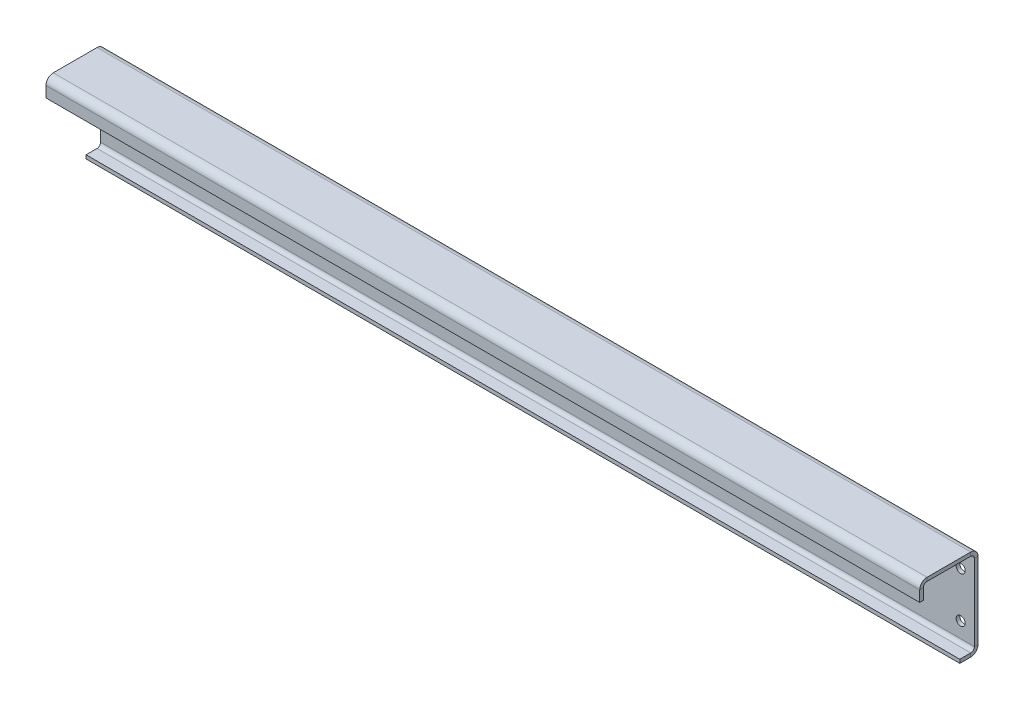
ISO-10303-21;
HEADER;
FILE_DESCRIPTION(('STEP AP214'),'2;1');
FILE_NAME('part.step','',(''),(''),'','','');
FILE_SCHEMA(('AUTOMOTIVE_DESIGN { 1 0 10303 214 1 1 1 1 }'));
ENDSEC;
DATA;
#1=APPLICATION_CONTEXT('core data for automotive mechanical design processes');
#2=APPLICATION_PROTOCOL_DEFINITION('international standard','automotive_design',2000,#1);
#3=PRODUCT_CONTEXT('',#1,'mechanical');
#4=PRODUCT('Part','Part','',(#3));
#5=PRODUCT_RELATED_PRODUCT_CATEGORY('part','',(#4));
#6=PRODUCT_DEFINITION_FORMATION('','',#4);
#7=PRODUCT_DEFINITION_CONTEXT('part definition',#1,'design');
#8=PRODUCT_DEFINITION('design','',#6,#7);
#9=PRODUCT_DEFINITION_SHAPE('','',#8);
#10=(LENGTH_UNIT() NAMED_UNIT(*) SI_UNIT(.MILLI.,.METRE.));
#11=(NAMED_UNIT(*) PLANE_ANGLE_UNIT() SI_UNIT($,.RADIAN.));
#12=(NAMED_UNIT(*) SI_UNIT($,.STERADIAN.) SOLID_ANGLE_UNIT());
#13=UNCERTAINTY_MEASURE_WITH_UNIT(LENGTH_MEASURE(1.E-05),#10,'distance_accuracy_value','');
#14=(GEOMETRIC_REPRESENTATION_CONTEXT(3) GLOBAL_UNCERTAINTY_ASSIGNED_CONTEXT((#13)) GLOBAL_UNIT_ASSIGNED_CONTEXT((#10,
#11,#12)) REPRESENTATION_CONTEXT('',''));
#15=CARTESIAN_POINT('',(0.,0.,0.));
#16=DIRECTION('',(0.,0.,1.));
#17=DIRECTION('',(1.,0.,0.));
#18=AXIS2_PLACEMENT_3D('',#15,#16,#17);
#19=CARTESIAN_POINT('',(-240.,37.8968253968254,-12.9523809523809));
#20=DIRECTION('',(1.,0.,0.));
#21=DIRECTION('',(0.,-1.,0.));
#22=AXIS2_PLACEMENT_3D('',#19,#20,#21);
#23=PLANE('',#22);
#24=DIRECTION('',(0.,0.,-1.));
#25=VECTOR('',#24,1.);
#26=CARTESIAN_POINT('',(-240.,-8.10317460317459,-12.952380952381));
#27=LINE('',#26,#25);
#28=CARTESIAN_POINT('',(-240.,-8.10317460317459,-10.952380952381));
#29=VERTEX_POINT('',#28);
#30=CARTESIAN_POINT('',(-240.,-8.10317460317459,-12.952380952381));
#31=VERTEX_POINT('',#30);
#32=EDGE_CURVE('E11',#29,#31,#27,.T.);
#33=ORIENTED_EDGE('',*,*,#32,.F.);
#34=DIRECTION('',(0.,1.,0.));
#35=VECTOR('',#34,1.);
#36=CARTESIAN_POINT('',(-240.,37.8968253968254,-10.9523809523809));
#37=LINE('',#36,#35);
#38=CARTESIAN_POINT('',(-240.,33.8968253968254,-10.9523809523809));
#39=VERTEX_POINT('',#38);
#40=EDGE_CURVE('E112',#39,#29,#37,.F.);
#41=ORIENTED_EDGE('',*,*,#40,.F.);
#42=DIRECTION('',(0.,0.,-1.));
#43=VECTOR('',#42,1.);
#44=CARTESIAN_POINT('',(-240.,33.8968253968254,-12.9523809523809));
#45=LINE('',#44,#43);
#46=CARTESIAN_POINT('',(-240.,33.8968253968254,-12.9523809523809));
#47=VERTEX_POINT('',#46);
#48=EDGE_CURVE('E48',#39,#47,#45,.T.);
#49=ORIENTED_EDGE('',*,*,#48,.T.);
#50=DIRECTION('',(0.,-1.,0.));
#51=VECTOR('',#50,1.);
#52=CARTESIAN_POINT('',(-240.,37.8968253968254,-12.9523809523809));
#53=LINE('',#52,#51);
#54=EDGE_CURVE('E115',#47,#31,#53,.T.);
#55=ORIENTED_EDGE('',*,*,#54,.T.);
#56=EDGE_LOOP('',(#33,#41,#49,#55));
#57=FACE_BOUND('',#56,.T.);
#58=ADVANCED_FACE('F38',(#57),#23,.F.);
#59=CARTESIAN_POINT('',(-240.,33.8968253968254,-8.95238095238095));
#60=DIRECTION('',(1.,0.,0.));
#61=DIRECTION('',(0.,0.,-1.));
#62=AXIS2_PLACEMENT_3D('',#59,#60,#61);
#63=PLANE('',#62);
#64=ORIENTED_EDGE('',*,*,#48,.F.);
#65=CARTESIAN_POINT('',(-240.,33.8968253968254,-8.95238095238095));
#66=DIRECTION('',(-1.,0.,0.));
#67=DIRECTION('',(0.,0.,1.));
#68=AXIS2_PLACEMENT_3D('',#65,#66,#67);
#69=CIRCLE('',#68,2.);
#70=CARTESIAN_POINT('',(-240.,35.8968253968254,-8.95238095238095));
#71=VERTEX_POINT('',#70);
#72=EDGE_CURVE('E154',#39,#71,#69,.F.);
#73=ORIENTED_EDGE('',*,*,#72,.T.);
#74=DIRECTION('',(0.,1.,0.));
#75=VECTOR('',#74,1.);
#76=CARTESIAN_POINT('',(-240.,37.8968253968254,-8.95238095238095));
#77=LINE('',#76,#75);
#78=CARTESIAN_POINT('',(-240.,37.8968253968254,-8.95238095238095));
#79=VERTEX_POINT('',#78);
#80=EDGE_CURVE('E191',#71,#79,#77,.T.);
#81=ORIENTED_EDGE('',*,*,#80,.T.);
#82=CARTESIAN_POINT('',(-240.,33.8968253968254,-8.95238095238095));
#83=DIRECTION('',(-1.,0.,0.));
#84=DIRECTION('',(0.,0.,1.));
#85=AXIS2_PLACEMENT_3D('',#82,#83,#84);
#86=CIRCLE('',#85,4.);
#87=EDGE_CURVE('E213',#47,#79,#86,.F.);
#88=ORIENTED_EDGE('',*,*,#87,.F.);
#89=EDGE_LOOP('',(#64,#73,#81,#88));
#90=FACE_BOUND('',#89,.T.);
#91=ADVANCED_FACE('F214',(#90),#63,.F.);
#92=CARTESIAN_POINT('',(-240.,37.8968253968254,19.0476190476191));
#93=DIRECTION('',(1.,0.,0.));
#94=DIRECTION('',(0.,0.,-1.));
#95=AXIS2_PLACEMENT_3D('',#92,#93,#94);
#96=PLANE('',#95);
#97=ORIENTED_EDGE('',*,*,#80,.F.);
#98=DIRECTION('',(0.,0.,1.));
#99=VECTOR('',#98,1.);
#100=CARTESIAN_POINT('',(-240.,35.8968253968254,19.0476190476191));
#101=LINE('',#100,#99);
#102=CARTESIAN_POINT('',(-240.,35.8968253968254,15.0476190476191));
#103=VERTEX_POINT('',#102);
#104=EDGE_CURVE('E267',#103,#71,#101,.F.);
#105=ORIENTED_EDGE('',*,*,#104,.F.);
#106=DIRECTION('',(0.,1.,0.));
#107=VECTOR('',#106,1.);
#108=CARTESIAN_POINT('',(-240.,37.8968253968254,15.0476190476191));
#109=LINE('',#108,#107);
#110=CARTESIAN_POINT('',(-240.,37.8968253968254,15.0476190476191));
#111=VERTEX_POINT('',#110);
#112=EDGE_CURVE('E56',#103,#111,#109,.T.);
#113=ORIENTED_EDGE('',*,*,#112,.T.);
#114=DIRECTION('',(0.,0.,-1.));
#115=VECTOR('',#114,1.);
#116=CARTESIAN_POINT('',(-240.,37.8968253968254,19.0476190476191));
#117=LINE('',#116,#115);
#118=EDGE_CURVE('E294',#111,#79,#117,.T.);
#119=ORIENTED_EDGE('',*,*,#118,.T.);
#120=EDGE_LOOP('',(#97,#105,#113,#119));
#121=FACE_BOUND('',#120,.T.);
#122=ADVANCED_FACE('F293',(#121),#96,.F.);
#123=CARTESIAN_POINT('',(-240.,33.8968253968254,15.0476190476191));
#124=DIRECTION('',(1.,0.,0.));
#125=DIRECTION('',(0.,0.,-1.));
#126=AXIS2_PLACEMENT_3D('',#123,#124,#125);
#127=PLANE('',#126);
#128=ORIENTED_EDGE('',*,*,#112,.F.);
#129=CARTESIAN_POINT('',(-240.,33.8968253968254,15.0476190476191));
#130=DIRECTION('',(-1.,0.,0.));
#131=DIRECTION('',(0.,0.,1.));
#132=AXIS2_PLACEMENT_3D('',#129,#130,#131);
#133=CIRCLE('',#132,2.);
#134=CARTESIAN_POINT('',(-240.,33.8968253968254,17.0476190476191));
#135=VERTEX_POINT('',#134);
#136=EDGE_CURVE('E271',#103,#135,#133,.F.);
#137=ORIENTED_EDGE('',*,*,#136,.T.);
#138=DIRECTION('',(0.,0.,1.));
#139=VECTOR('',#138,1.);
#140=CARTESIAN_POINT('',(-240.,33.8968253968254,19.0476190476191));
#141=LINE('',#140,#139);
#142=CARTESIAN_POINT('',(-240.,33.8968253968254,19.0476190476191));
#143=VERTEX_POINT('',#142);
#144=EDGE_CURVE('E187',#135,#143,#141,.T.);
#145=ORIENTED_EDGE('',*,*,#144,.T.);
#146=CARTESIAN_POINT('',(-240.,33.8968253968254,15.0476190476191));
#147=DIRECTION('',(-1.,0.,0.));
#148=DIRECTION('',(0.,0.,1.));
#149=AXIS2_PLACEMENT_3D('',#146,#147,#148);
#150=CIRCLE('',#149,4.);
#151=EDGE_CURVE('E240',#111,#143,#150,.F.);
#152=ORIENTED_EDGE('',*,*,#151,.F.);
#153=EDGE_LOOP('',(#128,#137,#145,#152));
#154=FACE_BOUND('',#153,.T.);
#155=ADVANCED_FACE('F402',(#154),#127,.F.);
#156=CARTESIAN_POINT('',(-240.,27.8968253968254,19.0476190476191));
#157=DIRECTION('',(1.,0.,0.));
#158=DIRECTION('',(0.,1.,0.));
#159=AXIS2_PLACEMENT_3D('',#156,#157,#158);
#160=PLANE('',#159);
#161=ORIENTED_EDGE('',*,*,#144,.F.);
#162=DIRECTION('',(0.,1.,0.));
#163=VECTOR('',#162,1.);
#164=CARTESIAN_POINT('',(-240.,27.8968253968254,17.0476190476191));
#165=LINE('',#164,#163);
#166=CARTESIAN_POINT('',(-240.,27.8968253968254,17.0476190476191));
#167=VERTEX_POINT('',#166);
#168=EDGE_CURVE('E151',#167,#135,#165,.T.);
#169=ORIENTED_EDGE('',*,*,#168,.F.);
#170=DIRECTION('',(0.,0.,1.));
#171=VECTOR('',#170,1.);
#172=CARTESIAN_POINT('',(-240.,27.8968253968254,19.0476190476191));
#173=LINE('',#172,#171);
#174=CARTESIAN_POINT('',(-240.,27.8968253968254,19.0476190476191));
#175=VERTEX_POINT('',#174);
#176=EDGE_CURVE('E184',#167,#175,#173,.T.);
#177=ORIENTED_EDGE('',*,*,#176,.T.);
#178=DIRECTION('',(0.,1.,0.));
#179=VECTOR('',#178,1.);
#180=CARTESIAN_POINT('',(-240.,27.8968253968254,19.0476190476191));
#181=LINE('',#180,#179);
#182=EDGE_CURVE('E334',#175,#143,#181,.T.);
#183=ORIENTED_EDGE('',*,*,#182,.T.);
#184=EDGE_LOOP('',(#161,#169,#177,#183));
#185=FACE_BOUND('',#184,.T.);
#186=ADVANCED_FACE('F335',(#185),#160,.F.);
#187=CARTESIAN_POINT('',(240.,27.8968253968254,19.0476190476191));
#188=DIRECTION('',(0.,1.,0.));
#189=DIRECTION('',(-1.,0.,0.));
#190=AXIS2_PLACEMENT_3D('',#187,#188,#189);
#191=PLANE('',#190);
#192=ORIENTED_EDGE('',*,*,#176,.F.);
#193=DIRECTION('',(1.,0.,0.));
#194=VECTOR('',#193,1.);
#195=CARTESIAN_POINT('',(240.,27.8968253968254,17.0476190476191));
#196=LINE('',#195,#194);
#197=CARTESIAN_POINT('',(240.,27.8968253968254,17.0476190476191));
#198=VERTEX_POINT('',#197);
#199=EDGE_CURVE('E275',#198,#167,#196,.F.);
#200=ORIENTED_EDGE('',*,*,#199,.F.);
#201=DIRECTION('',(0.,0.,1.));
#202=VECTOR('',#201,1.);
#203=CARTESIAN_POINT('',(240.,27.8968253968254,19.0476190476191));
#204=LINE('',#203,#202);
#205=CARTESIAN_POINT('',(240.,27.8968253968254,19.0476190476191));
#206=VERTEX_POINT('',#205);
#207=EDGE_CURVE('E181',#198,#206,#204,.T.);
#208=ORIENTED_EDGE('',*,*,#207,.T.);
#209=DIRECTION('',(-1.,0.,0.));
#210=VECTOR('',#209,1.);
#211=CARTESIAN_POINT('',(240.,27.8968253968254,19.0476190476191));
#212=LINE('',#211,#210);
#213=EDGE_CURVE('E325',#206,#175,#212,.T.);
#214=ORIENTED_EDGE('',*,*,#213,.T.);
#215=EDGE_LOOP('',(#192,#200,#208,#214));
#216=FACE_BOUND('',#215,.T.);
#217=ADVANCED_FACE('F376',(#216),#191,.F.);
#218=CARTESIAN_POINT('',(240.,27.8968253968254,19.0476190476191));
#219=DIRECTION('',(1.,0.,0.));
#220=DIRECTION('',(0.,1.,0.));
#221=AXIS2_PLACEMENT_3D('',#218,#219,#220);
#222=PLANE('',#221);
#223=ORIENTED_EDGE('',*,*,#207,.F.);
#224=DIRECTION('',(0.,1.,0.));
#225=VECTOR('',#224,1.);
#226=CARTESIAN_POINT('',(240.,27.8968253968254,17.0476190476191));
#227=LINE('',#226,#225);
#228=CARTESIAN_POINT('',(240.,33.8968253968254,17.0476190476191));
#229=VERTEX_POINT('',#228);
#230=EDGE_CURVE('E272',#198,#229,#227,.T.);
#231=ORIENTED_EDGE('',*,*,#230,.T.);
#232=DIRECTION('',(0.,0.,1.));
#233=VECTOR('',#232,1.);
#234=CARTESIAN_POINT('',(240.,33.8968253968254,19.0476190476191));
#235=LINE('',#234,#233);
#236=CARTESIAN_POINT('',(240.,33.8968253968254,19.0476190476191));
#237=VERTEX_POINT('',#236);
#238=EDGE_CURVE('E178',#229,#237,#235,.T.);
#239=ORIENTED_EDGE('',*,*,#238,.T.);
#240=DIRECTION('',(0.,1.,0.));
#241=VECTOR('',#240,1.);
#242=CARTESIAN_POINT('',(240.,27.8968253968254,19.0476190476191));
#243=LINE('',#242,#241);
#244=EDGE_CURVE('E300',#206,#237,#243,.T.);
#245=ORIENTED_EDGE('',*,*,#244,.F.);
#246=EDGE_LOOP('',(#223,#231,#239,#245));
#247=FACE_BOUND('',#246,.T.);
#248=ADVANCED_FACE('F313',(#247),#222,.T.);
#249=CARTESIAN_POINT('',(240.,33.8968253968254,15.0476190476191));
#250=DIRECTION('',(-1.,0.,0.));
#251=DIRECTION('',(0.,0.,1.));
#252=AXIS2_PLACEMENT_3D('',#249,#250,#251);
#253=PLANE('',#252);
#254=ORIENTED_EDGE('',*,*,#238,.F.);
#255=CARTESIAN_POINT('',(240.,33.8968253968254,15.0476190476191));
#256=DIRECTION('',(-1.,0.,0.));
#257=DIRECTION('',(0.,0.,1.));
#258=AXIS2_PLACEMENT_3D('',#255,#256,#257);
#259=CIRCLE('',#258,2.);
#260=CARTESIAN_POINT('',(240.,35.8968253968254,15.0476190476191));
#261=VERTEX_POINT('',#260);
#262=EDGE_CURVE('E268',#229,#261,#259,.T.);
#263=ORIENTED_EDGE('',*,*,#262,.T.);
#264=DIRECTION('',(0.,1.,0.));
#265=VECTOR('',#264,1.);
#266=CARTESIAN_POINT('',(240.,37.8968253968254,15.0476190476191));
#267=LINE('',#266,#265);
#268=CARTESIAN_POINT('',(240.,37.8968253968254,15.0476190476191));
#269=VERTEX_POINT('',#268);
#270=EDGE_CURVE('E176',#261,#269,#267,.T.);
#271=ORIENTED_EDGE('',*,*,#270,.T.);
#272=CARTESIAN_POINT('',(240.,33.8968253968254,15.0476190476191));
#273=DIRECTION('',(1.,0.,0.));
#274=DIRECTION('',(0.,0.,-1.));
#275=AXIS2_PLACEMENT_3D('',#272,#273,#274);
#276=CIRCLE('',#275,4.);
#277=EDGE_CURVE('E219',#237,#269,#276,.F.);
#278=ORIENTED_EDGE('',*,*,#277,.F.);
#279=EDGE_LOOP('',(#254,#263,#271,#278));
#280=FACE_BOUND('',#279,.T.);
#281=ADVANCED_FACE('F327',(#280),#253,.F.);
#282=CARTESIAN_POINT('',(240.,37.8968253968254,19.0476190476191));
#283=DIRECTION('',(1.,0.,0.));
#284=DIRECTION('',(0.,0.,-1.));
#285=AXIS2_PLACEMENT_3D('',#282,#283,#284);
#286=PLANE('',#285);
#287=ORIENTED_EDGE('',*,*,#270,.F.);
#288=DIRECTION('',(0.,0.,1.));
#289=VECTOR('',#288,1.);
#290=CARTESIAN_POINT('',(240.,35.8968253968254,19.0476190476191));
#291=LINE('',#290,#289);
#292=CARTESIAN_POINT('',(240.,35.8968253968254,-8.95238095238095));
#293=VERTEX_POINT('',#292);
#294=EDGE_CURVE('E144',#261,#293,#291,.F.);
#295=ORIENTED_EDGE('',*,*,#294,.T.);
#296=DIRECTION('',(0.,1.,0.));
#297=VECTOR('',#296,1.);
#298=CARTESIAN_POINT('',(240.,37.8968253968254,-8.95238095238095));
#299=LINE('',#298,#297);
#300=CARTESIAN_POINT('',(240.,37.8968253968254,-8.95238095238095));
#301=VERTEX_POINT('',#300);
#302=EDGE_CURVE('E173',#293,#301,#299,.T.);
#303=ORIENTED_EDGE('',*,*,#302,.T.);
#304=DIRECTION('',(0.,0.,-1.));
#305=VECTOR('',#304,1.);
#306=CARTESIAN_POINT('',(240.,37.8968253968254,19.0476190476191));
#307=LINE('',#306,#305);
#308=EDGE_CURVE('E210',#269,#301,#307,.T.);
#309=ORIENTED_EDGE('',*,*,#308,.F.);
#310=EDGE_LOOP('',(#287,#295,#303,#309));
#311=FACE_BOUND('',#310,.T.);
#312=ADVANCED_FACE('F382',(#311),#286,.T.);
#313=CARTESIAN_POINT('',(240.,33.8968253968254,-8.95238095238095));
#314=DIRECTION('',(-1.,0.,0.));
#315=DIRECTION('',(0.,0.,1.));
#316=AXIS2_PLACEMENT_3D('',#313,#314,#315);
#317=PLANE('',#316);
#318=ORIENTED_EDGE('',*,*,#302,.F.);
#319=CARTESIAN_POINT('',(240.,33.8968253968254,-8.95238095238095));
#320=DIRECTION('',(-1.,0.,0.));
#321=DIRECTION('',(0.,0.,1.));
#322=AXIS2_PLACEMENT_3D('',#319,#320,#321);
#323=CIRCLE('',#322,2.);
#324=CARTESIAN_POINT('',(240.,33.8968253968254,-10.9523809523809));
#325=VERTEX_POINT('',#324);
#326=EDGE_CURVE('E149',#293,#325,#323,.T.);
#327=ORIENTED_EDGE('',*,*,#326,.T.);
#328=DIRECTION('',(0.,0.,-1.));
#329=VECTOR('',#328,1.);
#330=CARTESIAN_POINT('',(240.,33.8968253968254,-12.9523809523809));
#331=LINE('',#330,#329);
#332=CARTESIAN_POINT('',(240.,33.8968253968254,-12.9523809523809));
#333=VERTEX_POINT('',#332);
#334=EDGE_CURVE('E170',#325,#333,#331,.T.);
#335=ORIENTED_EDGE('',*,*,#334,.T.);
#336=CARTESIAN_POINT('',(240.,33.8968253968254,-8.95238095238095));
#337=DIRECTION('',(1.,0.,0.));
#338=DIRECTION('',(0.,0.,-1.));
#339=AXIS2_PLACEMENT_3D('',#336,#337,#338);
#340=CIRCLE('',#339,4.);
#341=EDGE_CURVE('E218',#301,#333,#340,.F.);
#342=ORIENTED_EDGE('',*,*,#341,.F.);
#343=EDGE_LOOP('',(#318,#327,#335,#342));
#344=FACE_BOUND('',#343,.T.);
#345=ADVANCED_FACE('F384',(#344),#317,.F.);
#346=CARTESIAN_POINT('',(240.,37.8968253968254,-12.9523809523809));
#347=DIRECTION('',(1.,0.,0.));
#348=DIRECTION('',(0.,-1.,0.));
#349=AXIS2_PLACEMENT_3D('',#346,#347,#348);
#350=PLANE('',#349);
#351=ORIENTED_EDGE('',*,*,#334,.F.);
#352=DIRECTION('',(0.,1.,0.));
#353=VECTOR('',#352,1.);
#354=CARTESIAN_POINT('',(240.,37.8968253968254,-10.9523809523809));
#355=LINE('',#354,#353);
#356=CARTESIAN_POINT('',(240.,-8.10317460317459,-10.952380952381));
#357=VERTEX_POINT('',#356);
#358=EDGE_CURVE('E143',#325,#357,#355,.F.);
#359=ORIENTED_EDGE('',*,*,#358,.T.);
#360=DIRECTION('',(0.,0.,-1.));
#361=VECTOR('',#360,1.);
#362=CARTESIAN_POINT('',(240.,-8.10317460317459,-12.952380952381));
#363=LINE('',#362,#361);
#364=CARTESIAN_POINT('',(240.,-8.10317460317459,-12.952380952381));
#365=VERTEX_POINT('',#364);
#366=EDGE_CURVE('E167',#357,#365,#363,.T.);
#367=ORIENTED_EDGE('',*,*,#366,.T.);
#368=DIRECTION('',(0.,-1.,0.));
#369=VECTOR('',#368,1.);
#370=CARTESIAN_POINT('',(240.,37.8968253968254,-12.9523809523809));
#371=LINE('',#370,#369);
#372=EDGE_CURVE('E209',#333,#365,#371,.T.);
#373=ORIENTED_EDGE('',*,*,#372,.F.);
#374=EDGE_LOOP('',(#351,#359,#367,#373));
#375=FACE_BOUND('',#374,.T.);
#376=ADVANCED_FACE('F390',(#375),#350,.T.);
#377=CARTESIAN_POINT('',(240.,-8.10317460317459,-8.95238095238095));
#378=DIRECTION('',(-1.,0.,0.));
#379=DIRECTION('',(0.,0.,1.));
#380=AXIS2_PLACEMENT_3D('',#377,#378,#379);
#381=PLANE('',#380);
#382=ORIENTED_EDGE('',*,*,#366,.F.);
#383=CARTESIAN_POINT('',(240.,-8.10317460317459,-8.95238095238095));
#384=DIRECTION('',(-1.,0.,0.));
#385=DIRECTION('',(0.,0.,1.));
#386=AXIS2_PLACEMENT_3D('',#383,#384,#385);
#387=CIRCLE('',#386,2.);
#388=CARTESIAN_POINT('',(240.,-10.1031746031746,-8.95238095238095));
#389=VERTEX_POINT('',#388);
#390=EDGE_CURVE('E131',#357,#389,#387,.T.);
#391=ORIENTED_EDGE('',*,*,#390,.T.);
#392=DIRECTION('',(0.,-1.,0.));
#393=VECTOR('',#392,1.);
#394=CARTESIAN_POINT('',(240.,-12.1031746031746,-8.95238095238095));
#395=LINE('',#394,#393);
#396=CARTESIAN_POINT('',(240.,-12.1031746031746,-8.95238095238095));
#397=VERTEX_POINT('',#396);
#398=EDGE_CURVE('E164',#389,#397,#395,.T.);
#399=ORIENTED_EDGE('',*,*,#398,.T.);
#400=CARTESIAN_POINT('',(240.,-8.10317460317459,-8.95238095238095));
#401=DIRECTION('',(1.,0.,0.));
#402=DIRECTION('',(0.,0.,-1.));
#403=AXIS2_PLACEMENT_3D('',#400,#401,#402);
#404=CIRCLE('',#403,4.);
#405=EDGE_CURVE('E337',#365,#397,#404,.F.);
#406=ORIENTED_EDGE('',*,*,#405,.F.);
#407=EDGE_LOOP('',(#382,#391,#399,#406));
#408=FACE_BOUND('',#407,.T.);
#409=ADVANCED_FACE('F440',(#408),#381,.F.);
#410=CARTESIAN_POINT('',(240.,-12.1031746031746,-12.952380952381));
#411=DIRECTION('',(1.,0.,0.));
#412=DIRECTION('',(0.,0.,1.));
#413=AXIS2_PLACEMENT_3D('',#410,#411,#412);
#414=PLANE('',#413);
#415=ORIENTED_EDGE('',*,*,#398,.F.);
#416=DIRECTION('',(0.,0.,-1.));
#417=VECTOR('',#416,1.);
#418=CARTESIAN_POINT('',(240.,-10.1031746031746,-12.952380952381));
#419=LINE('',#418,#417);
#420=CARTESIAN_POINT('',(240.,-10.1031746031746,-2.95238095238095));
#421=VERTEX_POINT('',#420);
#422=EDGE_CURVE('E259',#389,#421,#419,.F.);
#423=ORIENTED_EDGE('',*,*,#422,.T.);
#424=DIRECTION('',(0.,-1.,0.));
#425=VECTOR('',#424,1.);
#426=CARTESIAN_POINT('',(240.,-12.1031746031746,-2.95238095238095));
#427=LINE('',#426,#425);
#428=CARTESIAN_POINT('',(240.,-12.1031746031746,-2.95238095238095));
#429=VERTEX_POINT('',#428);
#430=EDGE_CURVE('E161',#421,#429,#427,.T.);
#431=ORIENTED_EDGE('',*,*,#430,.T.);
#432=DIRECTION('',(0.,0.,1.));
#433=VECTOR('',#432,1.);
#434=CARTESIAN_POINT('',(240.,-12.1031746031746,-12.952380952381));
#435=LINE('',#434,#433);
#436=EDGE_CURVE('E349',#397,#429,#435,.T.);
#437=ORIENTED_EDGE('',*,*,#436,.F.);
#438=EDGE_LOOP('',(#415,#423,#431,#437));
#439=FACE_BOUND('',#438,.T.);
#440=ADVANCED_FACE('F451',(#439),#414,.T.);
#441=CARTESIAN_POINT('',(240.,-12.1031746031746,-2.95238095238095));
#442=DIRECTION('',(0.,0.,1.));
#443=DIRECTION('',(-1.,0.,0.));
#444=AXIS2_PLACEMENT_3D('',#441,#442,#443);
#445=PLANE('',#444);
#446=ORIENTED_EDGE('',*,*,#430,.F.);
#447=DIRECTION('',(1.,0.,0.));
#448=VECTOR('',#447,1.);
#449=CARTESIAN_POINT('',(240.,-10.1031746031746,-2.95238095238095));
#450=LINE('',#449,#448);
#451=CARTESIAN_POINT('',(-240.,-10.1031746031746,-2.95238095238095));
#452=VERTEX_POINT('',#451);
#453=EDGE_CURVE('E136',#421,#452,#450,.F.);
#454=ORIENTED_EDGE('',*,*,#453,.T.);
#455=DIRECTION('',(0.,-1.,0.));
#456=VECTOR('',#455,1.);
#457=CARTESIAN_POINT('',(-240.,-12.1031746031746,-2.95238095238095));
#458=LINE('',#457,#456);
#459=CARTESIAN_POINT('',(-240.,-12.1031746031746,-2.95238095238095));
#460=VERTEX_POINT('',#459);
#461=EDGE_CURVE('E158',#452,#460,#458,.T.);
#462=ORIENTED_EDGE('',*,*,#461,.T.);
#463=DIRECTION('',(-1.,0.,0.));
#464=VECTOR('',#463,1.);
#465=CARTESIAN_POINT('',(240.,-12.1031746031746,-2.95238095238095));
#466=LINE('',#465,#464);
#467=EDGE_CURVE('E352',#429,#460,#466,.T.);
#468=ORIENTED_EDGE('',*,*,#467,.F.);
#469=EDGE_LOOP('',(#446,#454,#462,#468));
#470=FACE_BOUND('',#469,.T.);
#471=ADVANCED_FACE('F462',(#470),#445,.T.);
#472=CARTESIAN_POINT('',(-240.,-12.1031746031746,-12.952380952381));
#473=DIRECTION('',(1.,0.,0.));
#474=DIRECTION('',(0.,0.,1.));
#475=AXIS2_PLACEMENT_3D('',#472,#473,#474);
#476=PLANE('',#475);
#477=ORIENTED_EDGE('',*,*,#461,.F.);
#478=DIRECTION('',(0.,0.,-1.));
#479=VECTOR('',#478,1.);
#480=CARTESIAN_POINT('',(-240.,-10.1031746031746,-12.952380952381));
#481=LINE('',#480,#479);
#482=CARTESIAN_POINT('',(-240.,-10.1031746031746,-8.95238095238095));
#483=VERTEX_POINT('',#482);
#484=EDGE_CURVE('E256',#483,#452,#481,.F.);
#485=ORIENTED_EDGE('',*,*,#484,.F.);
#486=DIRECTION('',(0.,-1.,0.));
#487=VECTOR('',#486,1.);
#488=CARTESIAN_POINT('',(-240.,-12.1031746031746,-8.95238095238095));
#489=LINE('',#488,#487);
#490=CARTESIAN_POINT('',(-240.,-12.1031746031746,-8.95238095238095));
#491=VERTEX_POINT('',#490);
#492=EDGE_CURVE('E42',#483,#491,#489,.T.);
#493=ORIENTED_EDGE('',*,*,#492,.T.);
#494=DIRECTION('',(0.,0.,1.));
#495=VECTOR('',#494,1.);
#496=CARTESIAN_POINT('',(-240.,-12.1031746031746,-12.952380952381));
#497=LINE('',#496,#495);
#498=EDGE_CURVE('E346',#491,#460,#497,.T.);
#499=ORIENTED_EDGE('',*,*,#498,.T.);
#500=EDGE_LOOP('',(#477,#485,#493,#499));
#501=FACE_BOUND('',#500,.T.);
#502=ADVANCED_FACE('F473',(#501),#476,.F.);
#503=CARTESIAN_POINT('',(-240.,-8.10317460317459,-8.95238095238095));
#504=DIRECTION('',(1.,0.,0.));
#505=DIRECTION('',(0.,0.,-1.));
#506=AXIS2_PLACEMENT_3D('',#503,#504,#505);
#507=PLANE('',#506);
#508=CARTESIAN_POINT('',(-240.,-8.10317460317459,-8.95238095238095));
#509=DIRECTION('',(-1.,0.,0.));
#510=DIRECTION('',(0.,0.,1.));
#511=AXIS2_PLACEMENT_3D('',#508,#509,#510);
#512=CIRCLE('',#511,2.);
#513=EDGE_CURVE('E128',#483,#29,#512,.F.);
#514=ORIENTED_EDGE('',*,*,#513,.T.);
#515=ORIENTED_EDGE('',*,*,#32,.T.);
#516=CARTESIAN_POINT('',(-240.,-8.10317460317459,-8.95238095238095));
#517=DIRECTION('',(-1.,0.,0.));
#518=DIRECTION('',(0.,0.,1.));
#519=AXIS2_PLACEMENT_3D('',#516,#517,#518);
#520=CIRCLE('',#519,4.);
#521=EDGE_CURVE('E236',#491,#31,#520,.F.);
#522=ORIENTED_EDGE('',*,*,#521,.F.);
#523=ORIENTED_EDGE('',*,*,#492,.F.);
#524=EDGE_LOOP('',(#514,#515,#522,#523));
#525=FACE_BOUND('',#524,.T.);
#526=ADVANCED_FACE('F40',(#525),#507,.F.);
#527=CARTESIAN_POINT('',(240.,-12.1031746031746,-12.952380952381));
#528=DIRECTION('',(0.,-1.,0.));
#529=DIRECTION('',(0.,0.,-1.));
#530=AXIS2_PLACEMENT_3D('',#527,#528,#529);
#531=PLANE('',#530);
#532=ORIENTED_EDGE('',*,*,#498,.F.);
#533=DIRECTION('',(-1.,0.,0.));
#534=VECTOR('',#533,1.);
#535=CARTESIAN_POINT('',(240.,-12.1031746031746,-8.95238095238095));
#536=LINE('',#535,#534);
#537=EDGE_CURVE('E232',#491,#397,#536,.F.);
#538=ORIENTED_EDGE('',*,*,#537,.T.);
#539=ORIENTED_EDGE('',*,*,#436,.T.);
#540=ORIENTED_EDGE('',*,*,#467,.T.);
#541=EDGE_LOOP('',(#532,#538,#539,#540));
#542=FACE_BOUND('',#541,.T.);
#543=ADVANCED_FACE('F493',(#542),#531,.T.);
#544=CARTESIAN_POINT('',(240.,37.8968253968254,-12.9523809523809));
#545=DIRECTION('',(0.,0.,-1.));
#546=DIRECTION('',(0.,1.,0.));
#547=AXIS2_PLACEMENT_3D('',#544,#545,#546);
#548=PLANE('',#547);
#549=CARTESIAN_POINT('',(232.5,25.3968253968256,-12.9523809523809));
#550=DIRECTION('',(0.,0.,-1.));
#551=DIRECTION('',(0.,1.,0.));
#552=AXIS2_PLACEMENT_3D('',#549,#550,#551);
#553=CIRCLE('',#552,2.5);
#554=CARTESIAN_POINT('',(232.5,27.8968253968256,-12.9523809523809));
#555=VERTEX_POINT('',#554);
#556=EDGE_CURVE('E828',#555,#555,#553,.T.);
#557=ORIENTED_EDGE('',*,*,#556,.F.);
#558=EDGE_LOOP('',(#557));
#559=FACE_BOUND('',#558,.T.);
#560=CARTESIAN_POINT('',(232.5,0.396825396825604,-12.952380952381));
#561=DIRECTION('',(0.,0.,-1.));
#562=DIRECTION('',(0.,1.,0.));
#563=AXIS2_PLACEMENT_3D('',#560,#561,#562);
#564=CIRCLE('',#563,2.49999999999997);
#565=CARTESIAN_POINT('',(232.5,2.89682539682557,-12.952380952381));
#566=VERTEX_POINT('',#565);
#567=EDGE_CURVE('E839',#566,#566,#564,.T.);
#568=ORIENTED_EDGE('',*,*,#567,.F.);
#569=EDGE_LOOP('',(#568));
#570=FACE_BOUND('',#569,.T.);
#571=CARTESIAN_POINT('',(207.5,0.396825396825604,-12.952380952381));
#572=DIRECTION('',(0.,0.,-1.));
#573=DIRECTION('',(0.,1.,0.));
#574=AXIS2_PLACEMENT_3D('',#571,#572,#573);
#575=CIRCLE('',#574,2.5);
#576=CARTESIAN_POINT('',(207.5,2.8968253968256,-12.952380952381));
#577=VERTEX_POINT('',#576);
#578=EDGE_CURVE('E845',#577,#577,#575,.T.);
#579=ORIENTED_EDGE('',*,*,#578,.F.);
#580=EDGE_LOOP('',(#579));
#581=FACE_BOUND('',#580,.T.);
#582=CARTESIAN_POINT('',(-232.5,25.3968253968256,-12.9523809523809));
#583=DIRECTION('',(0.,0.,-1.));
#584=DIRECTION('',(0.,1.,0.));
#585=AXIS2_PLACEMENT_3D('',#582,#583,#584);
#586=CIRCLE('',#585,2.5);
#587=CARTESIAN_POINT('',(-232.5,27.8968253968256,-12.9523809523809));
#588=VERTEX_POINT('',#587);
#589=EDGE_CURVE('E851',#588,#588,#586,.T.);
#590=ORIENTED_EDGE('',*,*,#589,.F.);
#591=EDGE_LOOP('',(#590));
#592=FACE_BOUND('',#591,.T.);
#593=CARTESIAN_POINT('',(-207.5,25.3968253968256,-12.9523809523809));
#594=DIRECTION('',(0.,0.,-1.));
#595=DIRECTION('',(0.,1.,0.));
#596=AXIS2_PLACEMENT_3D('',#593,#594,#595);
#597=CIRCLE('',#596,2.5);
#598=CARTESIAN_POINT('',(-207.5,27.8968253968256,-12.9523809523809));
#599=VERTEX_POINT('',#598);
#600=EDGE_CURVE('E882',#599,#599,#597,.T.);
#601=ORIENTED_EDGE('',*,*,#600,.F.);
#602=EDGE_LOOP('',(#601));
#603=FACE_BOUND('',#602,.T.);
#604=CARTESIAN_POINT('',(-207.5,0.396825396825607,-12.952380952381));
#605=DIRECTION('',(0.,0.,-1.));
#606=DIRECTION('',(0.,1.,0.));
#607=AXIS2_PLACEMENT_3D('',#604,#605,#606);
#608=CIRCLE('',#607,2.5);
#609=CARTESIAN_POINT('',(-207.5,2.8968253968256,-12.952380952381));
#610=VERTEX_POINT('',#609);
#611=EDGE_CURVE('E875',#610,#610,#608,.T.);
#612=ORIENTED_EDGE('',*,*,#611,.F.);
#613=EDGE_LOOP('',(#612));
#614=FACE_BOUND('',#613,.T.);
#615=CARTESIAN_POINT('',(-232.5,0.396825396825607,-12.952380952381));
#616=DIRECTION('',(0.,0.,-1.));
#617=DIRECTION('',(0.,1.,0.));
#618=AXIS2_PLACEMENT_3D('',#615,#616,#617);
#619=CIRCLE('',#618,2.5);
#620=CARTESIAN_POINT('',(-232.5,2.8968253968256,-12.952380952381));
#621=VERTEX_POINT('',#620);
#622=EDGE_CURVE('E876',#621,#621,#619,.T.);
#623=ORIENTED_EDGE('',*,*,#622,.F.);
#624=EDGE_LOOP('',(#623));
#625=FACE_BOUND('',#624,.T.);
#626=CARTESIAN_POINT('',(207.5,25.3968253968256,-12.9523809523809));
#627=DIRECTION('',(0.,0.,-1.));
#628=DIRECTION('',(0.,1.,0.));
#629=AXIS2_PLACEMENT_3D('',#626,#627,#628);
#630=CIRCLE('',#629,2.5);
#631=CARTESIAN_POINT('',(207.5,27.8968253968256,-12.9523809523809));
#632=VERTEX_POINT('',#631);
#633=EDGE_CURVE('E832',#632,#632,#630,.T.);
#634=ORIENTED_EDGE('',*,*,#633,.F.);
#635=EDGE_LOOP('',(#634));
#636=FACE_BOUND('',#635,.T.);
#637=ORIENTED_EDGE('',*,*,#54,.F.);
#638=DIRECTION('',(-1.,0.,0.));
#639=VECTOR('',#638,1.);
#640=CARTESIAN_POINT('',(240.,33.8968253968254,-12.9523809523809));
#641=LINE('',#640,#639);
#642=EDGE_CURVE('E206',#47,#333,#641,.F.);
#643=ORIENTED_EDGE('',*,*,#642,.T.);
#644=ORIENTED_EDGE('',*,*,#372,.T.);
#645=DIRECTION('',(-1.,0.,0.));
#646=VECTOR('',#645,1.);
#647=CARTESIAN_POINT('',(240.,-8.10317460317459,-12.952380952381));
#648=LINE('',#647,#646);
#649=EDGE_CURVE('E208',#365,#31,#648,.T.);
#650=ORIENTED_EDGE('',*,*,#649,.T.);
#651=EDGE_LOOP('',(#637,#643,#644,#650));
#652=FACE_BOUND('',#651,.T.);
#653=ADVANCED_FACE('F203',(#559,#570,#581,#592,#603,#614,#625,#636,#652),#548,.T.);
#654=CARTESIAN_POINT('',(240.,37.8968253968254,19.0476190476191));
#655=DIRECTION('',(0.,1.,0.));
#656=DIRECTION('',(0.,0.,1.));
#657=AXIS2_PLACEMENT_3D('',#654,#655,#656);
#658=PLANE('',#657);
#659=ORIENTED_EDGE('',*,*,#118,.F.);
#660=DIRECTION('',(-1.,0.,0.));
#661=VECTOR('',#660,1.);
#662=CARTESIAN_POINT('',(240.,37.8968253968254,15.0476190476191));
#663=LINE('',#662,#661);
#664=EDGE_CURVE('E229',#111,#269,#663,.F.);
#665=ORIENTED_EDGE('',*,*,#664,.T.);
#666=ORIENTED_EDGE('',*,*,#308,.T.);
#667=DIRECTION('',(-1.,0.,0.));
#668=VECTOR('',#667,1.);
#669=CARTESIAN_POINT('',(240.,37.8968253968254,-8.95238095238095));
#670=LINE('',#669,#668);
#671=EDGE_CURVE('E226',#301,#79,#670,.T.);
#672=ORIENTED_EDGE('',*,*,#671,.T.);
#673=EDGE_LOOP('',(#659,#665,#666,#672));
#674=FACE_BOUND('',#673,.T.);
#675=ADVANCED_FACE('F303',(#674),#658,.T.);
#676=CARTESIAN_POINT('',(240.,27.8968253968254,19.0476190476191));
#677=DIRECTION('',(0.,0.,1.));
#678=DIRECTION('',(1.,0.,0.));
#679=AXIS2_PLACEMENT_3D('',#676,#677,#678);
#680=PLANE('',#679);
#681=ORIENTED_EDGE('',*,*,#244,.T.);
#682=DIRECTION('',(-1.,0.,0.));
#683=VECTOR('',#682,1.);
#684=CARTESIAN_POINT('',(240.,33.8968253968254,19.0476190476191));
#685=LINE('',#684,#683);
#686=EDGE_CURVE('E225',#237,#143,#685,.T.);
#687=ORIENTED_EDGE('',*,*,#686,.T.);
#688=ORIENTED_EDGE('',*,*,#182,.F.);
#689=ORIENTED_EDGE('',*,*,#213,.F.);
#690=EDGE_LOOP('',(#681,#687,#688,#689));
#691=FACE_BOUND('',#690,.T.);
#692=ADVANCED_FACE('F321',(#691),#680,.T.);
#693=CARTESIAN_POINT('',(240.,-8.10317460317459,-8.95238095238095));
#694=DIRECTION('',(-1.,0.,0.));
#695=DIRECTION('',(0.,0.,1.));
#696=AXIS2_PLACEMENT_3D('',#693,#694,#695);
#697=CYLINDRICAL_SURFACE('',#696,4.);
#698=ORIENTED_EDGE('',*,*,#405,.T.);
#699=ORIENTED_EDGE('',*,*,#537,.F.);
#700=ORIENTED_EDGE('',*,*,#521,.T.);
#701=ORIENTED_EDGE('',*,*,#649,.F.);
#702=EDGE_LOOP('',(#698,#699,#700,#701));
#703=FACE_BOUND('',#702,.T.);
#704=ADVANCED_FACE('F360',(#703),#697,.T.);
#705=CARTESIAN_POINT('',(240.,33.8968253968254,-8.95238095238095));
#706=DIRECTION('',(-1.,0.,0.));
#707=DIRECTION('',(0.,0.,1.));
#708=AXIS2_PLACEMENT_3D('',#705,#706,#707);
#709=CYLINDRICAL_SURFACE('',#708,4.);
#710=ORIENTED_EDGE('',*,*,#341,.T.);
#711=ORIENTED_EDGE('',*,*,#642,.F.);
#712=ORIENTED_EDGE('',*,*,#87,.T.);
#713=ORIENTED_EDGE('',*,*,#671,.F.);
#714=EDGE_LOOP('',(#710,#711,#712,#713));
#715=FACE_BOUND('',#714,.T.);
#716=ADVANCED_FACE('F222',(#715),#709,.T.);
#717=CARTESIAN_POINT('',(240.,33.8968253968254,15.0476190476191));
#718=DIRECTION('',(-1.,0.,0.));
#719=DIRECTION('',(0.,0.,1.));
#720=AXIS2_PLACEMENT_3D('',#717,#718,#719);
#721=CYLINDRICAL_SURFACE('',#720,4.);
#722=ORIENTED_EDGE('',*,*,#277,.T.);
#723=ORIENTED_EDGE('',*,*,#664,.F.);
#724=ORIENTED_EDGE('',*,*,#151,.T.);
#725=ORIENTED_EDGE('',*,*,#686,.F.);
#726=EDGE_LOOP('',(#722,#723,#724,#725));
#727=FACE_BOUND('',#726,.T.);
#728=ADVANCED_FACE('F330',(#727),#721,.T.);
#729=CARTESIAN_POINT('',(240.,-10.1031746031746,-12.952380952381));
#730=DIRECTION('',(0.,-1.,0.));
#731=DIRECTION('',(0.,0.,-1.));
#732=AXIS2_PLACEMENT_3D('',#729,#730,#731);
#733=PLANE('',#732);
#734=ORIENTED_EDGE('',*,*,#484,.T.);
#735=ORIENTED_EDGE('',*,*,#453,.F.);
#736=ORIENTED_EDGE('',*,*,#422,.F.);
#737=DIRECTION('',(1.,0.,0.));
#738=VECTOR('',#737,1.);
#739=CARTESIAN_POINT('',(240.,-10.1031746031746,-8.95238095238095));
#740=LINE('',#739,#738);
#741=EDGE_CURVE('E135',#483,#389,#740,.T.);
#742=ORIENTED_EDGE('',*,*,#741,.F.);
#743=EDGE_LOOP('',(#734,#735,#736,#742));
#744=FACE_BOUND('',#743,.T.);
#745=ADVANCED_FACE('F550',(#744),#733,.F.);
#746=CARTESIAN_POINT('',(240.,37.8968253968254,-10.9523809523809));
#747=DIRECTION('',(0.,0.,-1.));
#748=DIRECTION('',(0.,1.,0.));
#749=AXIS2_PLACEMENT_3D('',#746,#747,#748);
#750=PLANE('',#749);
#751=CARTESIAN_POINT('',(232.5,25.3968253968256,-10.9523809523809));
#752=DIRECTION('',(0.,0.,-1.));
#753=DIRECTION('',(0.,1.,0.));
#754=AXIS2_PLACEMENT_3D('',#751,#752,#753);
#755=CIRCLE('',#754,2.5);
#756=CARTESIAN_POINT('',(232.5,27.8968253968256,-10.9523809523809));
#757=VERTEX_POINT('',#756);
#758=EDGE_CURVE('E831',#757,#757,#755,.F.);
#759=ORIENTED_EDGE('',*,*,#758,.F.);
#760=EDGE_LOOP('',(#759));
#761=FACE_BOUND('',#760,.T.);
#762=CARTESIAN_POINT('',(232.5,0.396825396825603,-10.952380952381));
#763=DIRECTION('',(0.,0.,-1.));
#764=DIRECTION('',(0.,1.,0.));
#765=AXIS2_PLACEMENT_3D('',#762,#763,#764);
#766=CIRCLE('',#765,2.49999999999997);
#767=CARTESIAN_POINT('',(232.5,2.89682539682557,-10.952380952381));
#768=VERTEX_POINT('',#767);
#769=EDGE_CURVE('E835',#768,#768,#766,.F.);
#770=ORIENTED_EDGE('',*,*,#769,.F.);
#771=EDGE_LOOP('',(#770));
#772=FACE_BOUND('',#771,.T.);
#773=CARTESIAN_POINT('',(207.5,0.396825396825603,-10.952380952381));
#774=DIRECTION('',(0.,0.,-1.));
#775=DIRECTION('',(0.,1.,0.));
#776=AXIS2_PLACEMENT_3D('',#773,#774,#775);
#777=CIRCLE('',#776,2.5);
#778=CARTESIAN_POINT('',(207.5,2.8968253968256,-10.952380952381));
#779=VERTEX_POINT('',#778);
#780=EDGE_CURVE('E842',#779,#779,#777,.F.);
#781=ORIENTED_EDGE('',*,*,#780,.F.);
#782=EDGE_LOOP('',(#781));
#783=FACE_BOUND('',#782,.T.);
#784=CARTESIAN_POINT('',(-232.5,25.3968253968256,-10.9523809523809));
#785=DIRECTION('',(0.,0.,-1.));
#786=DIRECTION('',(0.,1.,0.));
#787=AXIS2_PLACEMENT_3D('',#784,#785,#786);
#788=CIRCLE('',#787,2.5);
#789=CARTESIAN_POINT('',(-232.5,27.8968253968256,-10.9523809523809));
#790=VERTEX_POINT('',#789);
#791=EDGE_CURVE('E848',#790,#790,#788,.F.);
#792=ORIENTED_EDGE('',*,*,#791,.F.);
#793=EDGE_LOOP('',(#792));
#794=FACE_BOUND('',#793,.T.);
#795=CARTESIAN_POINT('',(-207.5,25.3968253968256,-10.9523809523809));
#796=DIRECTION('',(0.,0.,-1.));
#797=DIRECTION('',(0.,1.,0.));
#798=AXIS2_PLACEMENT_3D('',#795,#796,#797);
#799=CIRCLE('',#798,2.5);
#800=CARTESIAN_POINT('',(-207.5,27.8968253968256,-10.9523809523809));
#801=VERTEX_POINT('',#800);
#802=EDGE_CURVE('E854',#801,#801,#799,.F.);
#803=ORIENTED_EDGE('',*,*,#802,.F.);
#804=EDGE_LOOP('',(#803));
#805=FACE_BOUND('',#804,.T.);
#806=CARTESIAN_POINT('',(-207.5,0.396825396825607,-10.952380952381));
#807=DIRECTION('',(0.,0.,-1.));
#808=DIRECTION('',(0.,1.,0.));
#809=AXIS2_PLACEMENT_3D('',#806,#807,#808);
#810=CIRCLE('',#809,2.5);
#811=CARTESIAN_POINT('',(-207.5,2.8968253968256,-10.952380952381));
#812=VERTEX_POINT('',#811);
#813=EDGE_CURVE('E866',#812,#812,#810,.F.);
#814=ORIENTED_EDGE('',*,*,#813,.F.);
#815=EDGE_LOOP('',(#814));
#816=FACE_BOUND('',#815,.T.);
#817=CARTESIAN_POINT('',(-232.5,0.396825396825607,-10.952380952381));
#818=DIRECTION('',(0.,0.,-1.));
#819=DIRECTION('',(0.,1.,0.));
#820=AXIS2_PLACEMENT_3D('',#817,#818,#819);
#821=CIRCLE('',#820,2.5);
#822=CARTESIAN_POINT('',(-232.5,2.8968253968256,-10.952380952381));
#823=VERTEX_POINT('',#822);
#824=EDGE_CURVE('E870',#823,#823,#821,.F.);
#825=ORIENTED_EDGE('',*,*,#824,.F.);
#826=EDGE_LOOP('',(#825));
#827=FACE_BOUND('',#826,.T.);
#828=CARTESIAN_POINT('',(207.5,25.3968253968256,-10.9523809523809));
#829=DIRECTION('',(0.,0.,-1.));
#830=DIRECTION('',(0.,1.,0.));
#831=AXIS2_PLACEMENT_3D('',#828,#829,#830);
#832=CIRCLE('',#831,2.5);
#833=CARTESIAN_POINT('',(207.5,27.8968253968256,-10.9523809523809));
#834=VERTEX_POINT('',#833);
#835=EDGE_CURVE('E282',#834,#834,#832,.F.);
#836=ORIENTED_EDGE('',*,*,#835,.F.);
#837=EDGE_LOOP('',(#836));
#838=FACE_BOUND('',#837,.T.);
#839=ORIENTED_EDGE('',*,*,#40,.T.);
#840=DIRECTION('',(1.,0.,0.));
#841=VECTOR('',#840,1.);
#842=CARTESIAN_POINT('',(240.,-8.10317460317459,-10.952380952381));
#843=LINE('',#842,#841);
#844=EDGE_CURVE('E125',#357,#29,#843,.F.);
#845=ORIENTED_EDGE('',*,*,#844,.F.);
#846=ORIENTED_EDGE('',*,*,#358,.F.);
#847=DIRECTION('',(1.,0.,0.));
#848=VECTOR('',#847,1.);
#849=CARTESIAN_POINT('',(240.,33.8968253968254,-10.9523809523809));
#850=LINE('',#849,#848);
#851=EDGE_CURVE('E141',#39,#325,#850,.T.);
#852=ORIENTED_EDGE('',*,*,#851,.F.);
#853=EDGE_LOOP('',(#839,#845,#846,#852));
#854=FACE_BOUND('',#853,.T.);
#855=ADVANCED_FACE('F139',(#761,#772,#783,#794,#805,#816,#827,#838,#854),#750,.F.);
#856=CARTESIAN_POINT('',(240.,35.8968253968254,19.0476190476191));
#857=DIRECTION('',(0.,1.,0.));
#858=DIRECTION('',(0.,0.,1.));
#859=AXIS2_PLACEMENT_3D('',#856,#857,#858);
#860=PLANE('',#859);
#861=ORIENTED_EDGE('',*,*,#104,.T.);
#862=DIRECTION('',(1.,0.,0.));
#863=VECTOR('',#862,1.);
#864=CARTESIAN_POINT('',(240.,35.8968253968254,-8.95238095238095));
#865=LINE('',#864,#863);
#866=EDGE_CURVE('E246',#293,#71,#865,.F.);
#867=ORIENTED_EDGE('',*,*,#866,.F.);
#868=ORIENTED_EDGE('',*,*,#294,.F.);
#869=DIRECTION('',(1.,0.,0.));
#870=VECTOR('',#869,1.);
#871=CARTESIAN_POINT('',(240.,35.8968253968254,15.0476190476191));
#872=LINE('',#871,#870);
#873=EDGE_CURVE('E243',#103,#261,#872,.T.);
#874=ORIENTED_EDGE('',*,*,#873,.F.);
#875=EDGE_LOOP('',(#861,#867,#868,#874));
#876=FACE_BOUND('',#875,.T.);
#877=ADVANCED_FACE('F291',(#876),#860,.F.);
#878=CARTESIAN_POINT('',(240.,27.8968253968254,17.0476190476191));
#879=DIRECTION('',(0.,0.,1.));
#880=DIRECTION('',(1.,0.,0.));
#881=AXIS2_PLACEMENT_3D('',#878,#879,#880);
#882=PLANE('',#881);
#883=ORIENTED_EDGE('',*,*,#230,.F.);
#884=ORIENTED_EDGE('',*,*,#199,.T.);
#885=ORIENTED_EDGE('',*,*,#168,.T.);
#886=DIRECTION('',(1.,0.,0.));
#887=VECTOR('',#886,1.);
#888=CARTESIAN_POINT('',(240.,33.8968253968254,17.0476190476191));
#889=LINE('',#888,#887);
#890=EDGE_CURVE('E249',#229,#135,#889,.F.);
#891=ORIENTED_EDGE('',*,*,#890,.F.);
#892=EDGE_LOOP('',(#883,#884,#885,#891));
#893=FACE_BOUND('',#892,.T.);
#894=ADVANCED_FACE('F378',(#893),#882,.F.);
#895=CARTESIAN_POINT('',(240.,-8.10317460317459,-8.95238095238095));
#896=DIRECTION('',(-1.,0.,0.));
#897=DIRECTION('',(0.,0.,1.));
#898=AXIS2_PLACEMENT_3D('',#895,#896,#897);
#899=CYLINDRICAL_SURFACE('',#898,2.);
#900=ORIENTED_EDGE('',*,*,#390,.F.);
#901=ORIENTED_EDGE('',*,*,#844,.T.);
#902=ORIENTED_EDGE('',*,*,#513,.F.);
#903=ORIENTED_EDGE('',*,*,#741,.T.);
#904=EDGE_LOOP('',(#900,#901,#902,#903));
#905=FACE_BOUND('',#904,.T.);
#906=ADVANCED_FACE('F126',(#905),#899,.F.);
#907=CARTESIAN_POINT('',(240.,33.8968253968254,-8.95238095238095));
#908=DIRECTION('',(-1.,0.,0.));
#909=DIRECTION('',(0.,0.,1.));
#910=AXIS2_PLACEMENT_3D('',#907,#908,#909);
#911=CYLINDRICAL_SURFACE('',#910,2.);
#912=ORIENTED_EDGE('',*,*,#326,.F.);
#913=ORIENTED_EDGE('',*,*,#866,.T.);
#914=ORIENTED_EDGE('',*,*,#72,.F.);
#915=ORIENTED_EDGE('',*,*,#851,.T.);
#916=EDGE_LOOP('',(#912,#913,#914,#915));
#917=FACE_BOUND('',#916,.T.);
#918=ADVANCED_FACE('F286',(#917),#911,.F.);
#919=CARTESIAN_POINT('',(240.,33.8968253968254,15.0476190476191));
#920=DIRECTION('',(-1.,0.,0.));
#921=DIRECTION('',(0.,0.,1.));
#922=AXIS2_PLACEMENT_3D('',#919,#920,#921);
#923=CYLINDRICAL_SURFACE('',#922,2.);
#924=ORIENTED_EDGE('',*,*,#262,.F.);
#925=ORIENTED_EDGE('',*,*,#890,.T.);
#926=ORIENTED_EDGE('',*,*,#136,.F.);
#927=ORIENTED_EDGE('',*,*,#873,.T.);
#928=EDGE_LOOP('',(#924,#925,#926,#927));
#929=FACE_BOUND('',#928,.T.);
#930=ADVANCED_FACE('F381',(#929),#923,.F.);
#931=CARTESIAN_POINT('',(207.5,25.3968253968256,19.0486190476191));
#932=DIRECTION('',(0.,0.,-1.));
#933=DIRECTION('',(0.,1.,0.));
#934=AXIS2_PLACEMENT_3D('',#931,#932,#933);
#935=CYLINDRICAL_SURFACE('',#934,2.5);
#936=ORIENTED_EDGE('',*,*,#633,.T.);
#937=EDGE_LOOP('',(#936));
#938=FACE_BOUND('',#937,.T.);
#939=ORIENTED_EDGE('',*,*,#835,.T.);
#940=EDGE_LOOP('',(#939));
#941=FACE_BOUND('',#940,.T.);
#942=ADVANCED_FACE('F608',(#938,#941),#935,.F.);
#943=CARTESIAN_POINT('',(-232.5,0.396825396825603,19.0486190476191));
#944=DIRECTION('',(0.,0.,-1.));
#945=DIRECTION('',(0.,1.,0.));
#946=AXIS2_PLACEMENT_3D('',#943,#944,#945);
#947=CYLINDRICAL_SURFACE('',#946,2.5);
#948=ORIENTED_EDGE('',*,*,#622,.T.);
#949=EDGE_LOOP('',(#948));
#950=FACE_BOUND('',#949,.T.);
#951=ORIENTED_EDGE('',*,*,#824,.T.);
#952=EDGE_LOOP('',(#951));
#953=FACE_BOUND('',#952,.T.);
#954=ADVANCED_FACE('F634',(#950,#953),#947,.F.);
#955=CARTESIAN_POINT('',(-207.5,0.396825396825603,19.0486190476191));
#956=DIRECTION('',(0.,0.,-1.));
#957=DIRECTION('',(0.,1.,0.));
#958=AXIS2_PLACEMENT_3D('',#955,#956,#957);
#959=CYLINDRICAL_SURFACE('',#958,2.5);
#960=ORIENTED_EDGE('',*,*,#611,.T.);
#961=EDGE_LOOP('',(#960));
#962=FACE_BOUND('',#961,.T.);
#963=ORIENTED_EDGE('',*,*,#813,.T.);
#964=EDGE_LOOP('',(#963));
#965=FACE_BOUND('',#964,.T.);
#966=ADVANCED_FACE('F645',(#962,#965),#959,.F.);
#967=CARTESIAN_POINT('',(-207.5,25.3968253968256,19.0486190476191));
#968=DIRECTION('',(0.,0.,-1.));
#969=DIRECTION('',(0.,1.,0.));
#970=AXIS2_PLACEMENT_3D('',#967,#968,#969);
#971=CYLINDRICAL_SURFACE('',#970,2.5);
#972=ORIENTED_EDGE('',*,*,#600,.T.);
#973=EDGE_LOOP('',(#972));
#974=FACE_BOUND('',#973,.T.);
#975=ORIENTED_EDGE('',*,*,#802,.T.);
#976=EDGE_LOOP('',(#975));
#977=FACE_BOUND('',#976,.T.);
#978=ADVANCED_FACE('F656',(#974,#977),#971,.F.);
#979=CARTESIAN_POINT('',(-232.5,25.3968253968256,19.0486190476191));
#980=DIRECTION('',(0.,0.,-1.));
#981=DIRECTION('',(0.,1.,0.));
#982=AXIS2_PLACEMENT_3D('',#979,#980,#981);
#983=CYLINDRICAL_SURFACE('',#982,2.5);
#984=ORIENTED_EDGE('',*,*,#589,.T.);
#985=EDGE_LOOP('',(#984));
#986=FACE_BOUND('',#985,.T.);
#987=ORIENTED_EDGE('',*,*,#791,.T.);
#988=EDGE_LOOP('',(#987));
#989=FACE_BOUND('',#988,.T.);
#990=ADVANCED_FACE('F667',(#986,#989),#983,.F.);
#991=CARTESIAN_POINT('',(207.5,0.396825396825599,19.0486190476191));
#992=DIRECTION('',(0.,0.,-1.));
#993=DIRECTION('',(0.,1.,0.));
#994=AXIS2_PLACEMENT_3D('',#991,#992,#993);
#995=CYLINDRICAL_SURFACE('',#994,2.5);
#996=ORIENTED_EDGE('',*,*,#578,.T.);
#997=EDGE_LOOP('',(#996));
#998=FACE_BOUND('',#997,.T.);
#999=ORIENTED_EDGE('',*,*,#780,.T.);
#1000=EDGE_LOOP('',(#999));
#1001=FACE_BOUND('',#1000,.T.);
#1002=ADVANCED_FACE('F678',(#998,#1001),#995,.F.);
#1003=CARTESIAN_POINT('',(232.5,0.396825396825599,19.0486190476191));
#1004=DIRECTION('',(0.,0.,-1.));
#1005=DIRECTION('',(0.,1.,0.));
#1006=AXIS2_PLACEMENT_3D('',#1003,#1004,#1005);
#1007=CYLINDRICAL_SURFACE('',#1006,2.49999999999997);
#1008=ORIENTED_EDGE('',*,*,#567,.T.);
#1009=EDGE_LOOP('',(#1008));
#1010=FACE_BOUND('',#1009,.T.);
#1011=ORIENTED_EDGE('',*,*,#769,.T.);
#1012=EDGE_LOOP('',(#1011));
#1013=FACE_BOUND('',#1012,.T.);
#1014=ADVANCED_FACE('F689',(#1010,#1013),#1007,.F.);
#1015=CARTESIAN_POINT('',(232.5,25.3968253968256,19.0486190476191));
#1016=DIRECTION('',(0.,0.,-1.));
#1017=DIRECTION('',(0.,1.,0.));
#1018=AXIS2_PLACEMENT_3D('',#1015,#1016,#1017);
#1019=CYLINDRICAL_SURFACE('',#1018,2.5);
#1020=ORIENTED_EDGE('',*,*,#556,.T.);
#1021=EDGE_LOOP('',(#1020));
#1022=FACE_BOUND('',#1021,.T.);
#1023=ORIENTED_EDGE('',*,*,#758,.T.);
#1024=EDGE_LOOP('',(#1023));
#1025=FACE_BOUND('',#1024,.T.);
#1026=ADVANCED_FACE('F700',(#1022,#1025),#1019,.F.);
#1027=CLOSED_SHELL('',(#58,#91,#122,#155,#186,#217,#248,#281,#312,#345,#376,#409,#440,#471,#502,
#526,#543,#653,#675,#692,#704,#716,#728,#745,#855,#877,#894,#906,#918,#930,#942,#954,#966,#978,
#990,#1002,#1014,#1026));
#1028=MANIFOLD_SOLID_BREP('B2',#1027);
#1029=ADVANCED_BREP_SHAPE_REPRESENTATION('',(#18,#1028),#14);
#1030=SHAPE_DEFINITION_REPRESENTATION(#9,#1029);
ENDSEC;
END-ISO-10303-21;
